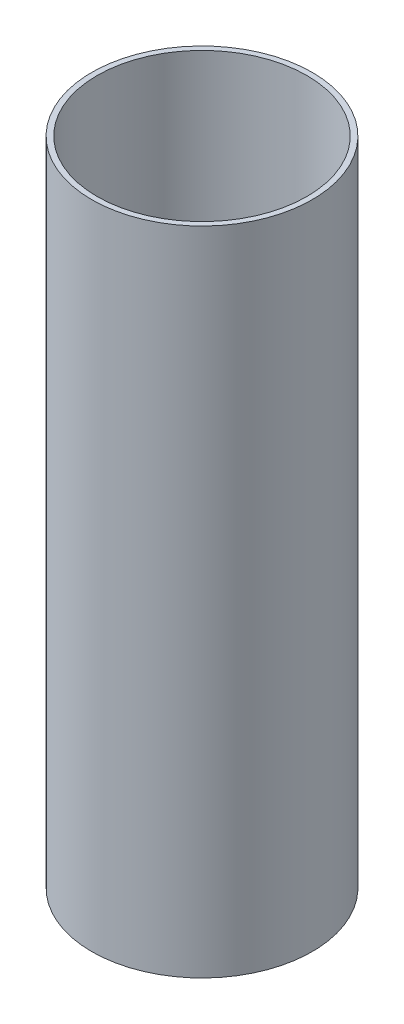
ISO-10303-21;
HEADER;
FILE_DESCRIPTION(('STEP AP214'),'2;1');
FILE_NAME('part.step','',(''),(''),'','','');
FILE_SCHEMA(('AUTOMOTIVE_DESIGN { 1 0 10303 214 1 1 1 1 }'));
ENDSEC;
DATA;
#1=APPLICATION_CONTEXT('core data for automotive mechanical design processes');
#2=APPLICATION_PROTOCOL_DEFINITION('international standard','automotive_design',2000,#1);
#3=PRODUCT_CONTEXT('',#1,'mechanical');
#4=PRODUCT('Part','Part','',(#3));
#5=PRODUCT_RELATED_PRODUCT_CATEGORY('part','',(#4));
#6=PRODUCT_DEFINITION_FORMATION('','',#4);
#7=PRODUCT_DEFINITION_CONTEXT('part definition',#1,'design');
#8=PRODUCT_DEFINITION('design','',#6,#7);
#9=PRODUCT_DEFINITION_SHAPE('','',#8);
#10=(LENGTH_UNIT() NAMED_UNIT(*) SI_UNIT(.MILLI.,.METRE.));
#11=(NAMED_UNIT(*) PLANE_ANGLE_UNIT() SI_UNIT($,.RADIAN.));
#12=(NAMED_UNIT(*) SI_UNIT($,.STERADIAN.) SOLID_ANGLE_UNIT());
#13=UNCERTAINTY_MEASURE_WITH_UNIT(LENGTH_MEASURE(1.E-05),#10,'distance_accuracy_value','');
#14=(GEOMETRIC_REPRESENTATION_CONTEXT(3) GLOBAL_UNCERTAINTY_ASSIGNED_CONTEXT((#13)) GLOBAL_UNIT_ASSIGNED_CONTEXT((#10,
#11,#12)) REPRESENTATION_CONTEXT('',''));
#15=CARTESIAN_POINT('',(0.,0.,0.));
#16=DIRECTION('',(0.,0.,1.));
#17=DIRECTION('',(1.,0.,0.));
#18=AXIS2_PLACEMENT_3D('',#15,#16,#17);
#19=CARTESIAN_POINT('',(0.,150.,0.));
#20=DIRECTION('',(0.,1.,0.));
#21=DIRECTION('',(0.,0.,1.));
#22=AXIS2_PLACEMENT_3D('',#19,#20,#21);
#23=PLANE('',#22);
#24=CARTESIAN_POINT('',(0.,150.,0.));
#25=DIRECTION('',(0.,1.,0.));
#26=DIRECTION('',(0.,0.,1.));
#27=AXIS2_PLACEMENT_3D('',#24,#25,#26);
#28=CIRCLE('',#27,25.4);
#29=CARTESIAN_POINT('',(0.,150.,25.4));
#30=VERTEX_POINT('',#29);
#31=EDGE_CURVE('E10',#30,#30,#28,.T.);
#32=ORIENTED_EDGE('',*,*,#31,.T.);
#33=EDGE_LOOP('',(#32));
#34=FACE_BOUND('',#33,.T.);
#35=CARTESIAN_POINT('',(0.,150.,0.));
#36=DIRECTION('',(0.,1.,0.));
#37=DIRECTION('',(0.,0.,1.));
#38=AXIS2_PLACEMENT_3D('',#35,#36,#37);
#39=CIRCLE('',#38,24.1554);
#40=CARTESIAN_POINT('',(0.,150.,24.1554));
#41=VERTEX_POINT('',#40);
#42=EDGE_CURVE('E50',#41,#41,#39,.T.);
#43=ORIENTED_EDGE('',*,*,#42,.F.);
#44=EDGE_LOOP('',(#43));
#45=FACE_BOUND('',#44,.T.);
#46=ADVANCED_FACE('F35',(#34,#45),#23,.T.);
#47=CARTESIAN_POINT('',(0.,0.,0.));
#48=DIRECTION('',(0.,1.,0.));
#49=DIRECTION('',(0.,0.,1.));
#50=AXIS2_PLACEMENT_3D('',#47,#48,#49);
#51=PLANE('',#50);
#52=CARTESIAN_POINT('',(0.,0.,0.));
#53=DIRECTION('',(0.,1.,0.));
#54=DIRECTION('',(0.,0.,1.));
#55=AXIS2_PLACEMENT_3D('',#52,#53,#54);
#56=CIRCLE('',#55,25.4);
#57=CARTESIAN_POINT('',(0.,0.,25.4));
#58=VERTEX_POINT('',#57);
#59=EDGE_CURVE('E39',#58,#58,#56,.T.);
#60=ORIENTED_EDGE('',*,*,#59,.F.);
#61=EDGE_LOOP('',(#60));
#62=FACE_BOUND('',#61,.T.);
#63=CARTESIAN_POINT('',(0.,0.,0.));
#64=DIRECTION('',(0.,1.,0.));
#65=DIRECTION('',(0.,0.,1.));
#66=AXIS2_PLACEMENT_3D('',#63,#64,#65);
#67=CIRCLE('',#66,24.1554);
#68=CARTESIAN_POINT('',(0.,0.,24.1554));
#69=VERTEX_POINT('',#68);
#70=EDGE_CURVE('E52',#69,#69,#67,.T.);
#71=ORIENTED_EDGE('',*,*,#70,.T.);
#72=EDGE_LOOP('',(#71));
#73=FACE_BOUND('',#72,.T.);
#74=ADVANCED_FACE('F62',(#62,#73),#51,.F.);
#75=CARTESIAN_POINT('',(0.,150.,0.));
#76=DIRECTION('',(0.,-1.,0.));
#77=DIRECTION('',(0.,0.,-1.));
#78=AXIS2_PLACEMENT_3D('',#75,#76,#77);
#79=CYLINDRICAL_SURFACE('',#78,25.4);
#80=ORIENTED_EDGE('',*,*,#31,.F.);
#81=EDGE_LOOP('',(#80));
#82=FACE_BOUND('',#81,.T.);
#83=ORIENTED_EDGE('',*,*,#59,.T.);
#84=EDGE_LOOP('',(#83));
#85=FACE_BOUND('',#84,.T.);
#86=ADVANCED_FACE('F37',(#82,#85),#79,.T.);
#87=CARTESIAN_POINT('',(0.,150.,0.));
#88=DIRECTION('',(0.,-1.,0.));
#89=DIRECTION('',(0.,0.,-1.));
#90=AXIS2_PLACEMENT_3D('',#87,#88,#89);
#91=CYLINDRICAL_SURFACE('',#90,24.1554);
#92=ORIENTED_EDGE('',*,*,#42,.T.);
#93=EDGE_LOOP('',(#92));
#94=FACE_BOUND('',#93,.T.);
#95=ORIENTED_EDGE('',*,*,#70,.F.);
#96=EDGE_LOOP('',(#95));
#97=FACE_BOUND('',#96,.T.);
#98=ADVANCED_FACE('F58',(#94,#97),#91,.F.);
#99=CLOSED_SHELL('',(#46,#74,#86,#98));
#100=MANIFOLD_SOLID_BREP('B2',#99);
#101=ADVANCED_BREP_SHAPE_REPRESENTATION('',(#18,#100),#14);
#102=SHAPE_DEFINITION_REPRESENTATION(#9,#101);
ENDSEC;
END-ISO-10303-21;
